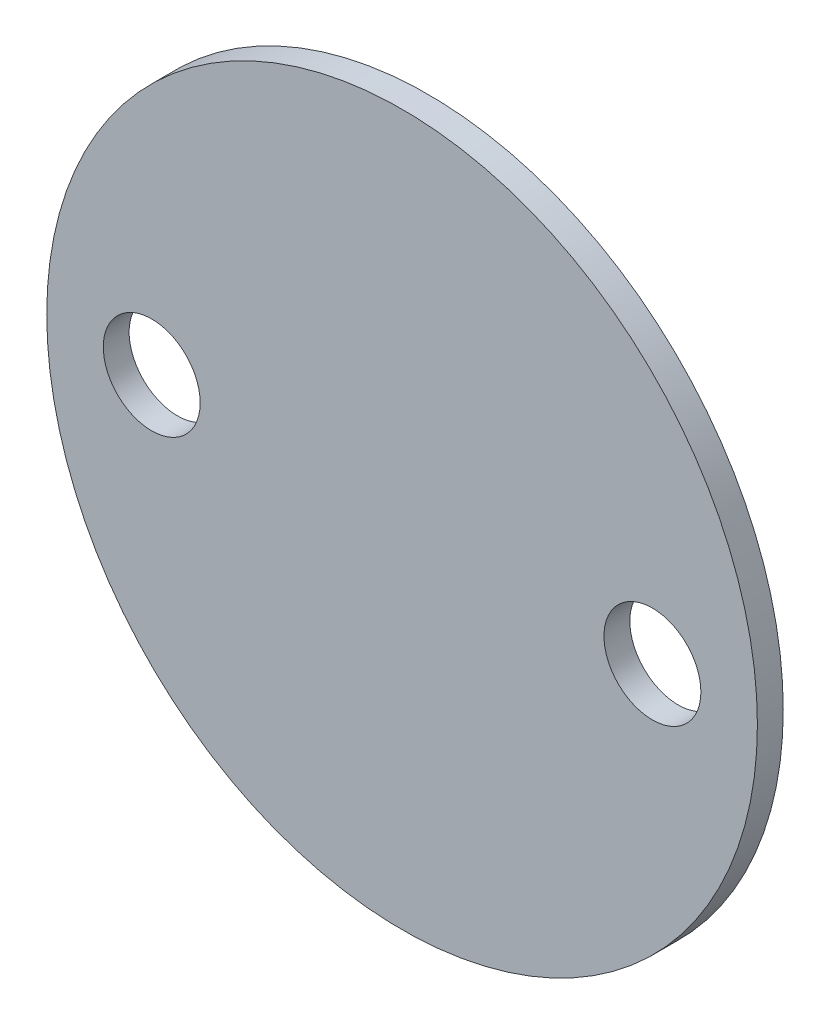
ISO-10303-21;
HEADER;
FILE_DESCRIPTION(('STEP AP214'),'2;1');
FILE_NAME('part.step','',(''),(''),'','','');
FILE_SCHEMA(('AUTOMOTIVE_DESIGN { 1 0 10303 214 1 1 1 1 }'));
ENDSEC;
DATA;
#1=APPLICATION_CONTEXT('core data for automotive mechanical design processes');
#2=APPLICATION_PROTOCOL_DEFINITION('international standard','automotive_design',2000,#1);
#3=PRODUCT_CONTEXT('',#1,'mechanical');
#4=PRODUCT('Part','Part','',(#3));
#5=PRODUCT_RELATED_PRODUCT_CATEGORY('part','',(#4));
#6=PRODUCT_DEFINITION_FORMATION('','',#4);
#7=PRODUCT_DEFINITION_CONTEXT('part definition',#1,'design');
#8=PRODUCT_DEFINITION('design','',#6,#7);
#9=PRODUCT_DEFINITION_SHAPE('','',#8);
#10=(LENGTH_UNIT() NAMED_UNIT(*) SI_UNIT(.MILLI.,.METRE.));
#11=(NAMED_UNIT(*) PLANE_ANGLE_UNIT() SI_UNIT($,.RADIAN.));
#12=(NAMED_UNIT(*) SI_UNIT($,.STERADIAN.) SOLID_ANGLE_UNIT());
#13=UNCERTAINTY_MEASURE_WITH_UNIT(LENGTH_MEASURE(1.E-05),#10,'distance_accuracy_value','');
#14=(GEOMETRIC_REPRESENTATION_CONTEXT(3) GLOBAL_UNCERTAINTY_ASSIGNED_CONTEXT((#13)) GLOBAL_UNIT_ASSIGNED_CONTEXT((#10,
#11,#12)) REPRESENTATION_CONTEXT('',''));
#15=CARTESIAN_POINT('',(0.,0.,0.));
#16=DIRECTION('',(0.,0.,1.));
#17=DIRECTION('',(1.,0.,0.));
#18=AXIS2_PLACEMENT_3D('',#15,#16,#17);
#19=CARTESIAN_POINT('',(-7.85352633355807,0.,0.8));
#20=DIRECTION('',(0.,0.,1.));
#21=DIRECTION('',(1.,0.,0.));
#22=AXIS2_PLACEMENT_3D('',#19,#20,#21);
#23=PLANE('',#22);
#24=CARTESIAN_POINT('',(-15.6035263335581,0.,0.8));
#25=DIRECTION('',(0.,0.,1.));
#26=DIRECTION('',(1.,0.,0.));
#27=AXIS2_PLACEMENT_3D('',#24,#25,#26);
#28=CIRCLE('',#27,1.5);
#29=CARTESIAN_POINT('',(-14.1035263335581,0.,0.8));
#30=VERTEX_POINT('',#29);
#31=EDGE_CURVE('E42',#30,#30,#28,.T.);
#32=ORIENTED_EDGE('',*,*,#31,.F.);
#33=EDGE_LOOP('',(#32));
#34=FACE_BOUND('',#33,.T.);
#35=CARTESIAN_POINT('',(-7.85352633355807,0.,0.8));
#36=DIRECTION('',(0.,0.,1.));
#37=DIRECTION('',(1.,0.,0.));
#38=AXIS2_PLACEMENT_3D('',#35,#36,#37);
#39=CIRCLE('',#38,11.);
#40=CARTESIAN_POINT('',(3.14647366644193,0.,0.8));
#41=VERTEX_POINT('',#40);
#42=EDGE_CURVE('E10',#41,#41,#39,.T.);
#43=ORIENTED_EDGE('',*,*,#42,.T.);
#44=EDGE_LOOP('',(#43));
#45=FACE_BOUND('',#44,.T.);
#46=CARTESIAN_POINT('',(-0.10352633355807,0.,0.8));
#47=DIRECTION('',(0.,0.,1.));
#48=DIRECTION('',(1.,0.,0.));
#49=AXIS2_PLACEMENT_3D('',#46,#47,#48);
#50=CIRCLE('',#49,1.5);
#51=CARTESIAN_POINT('',(1.39647366644193,0.,0.8));
#52=VERTEX_POINT('',#51);
#53=EDGE_CURVE('E47',#52,#52,#50,.T.);
#54=ORIENTED_EDGE('',*,*,#53,.F.);
#55=EDGE_LOOP('',(#54));
#56=FACE_BOUND('',#55,.T.);
#57=ADVANCED_FACE('F31',(#34,#45,#56),#23,.T.);
#58=CARTESIAN_POINT('',(-7.85352633355807,0.,0.));
#59=DIRECTION('',(0.,0.,1.));
#60=DIRECTION('',(1.,0.,0.));
#61=AXIS2_PLACEMENT_3D('',#58,#59,#60);
#62=PLANE('',#61);
#63=CARTESIAN_POINT('',(-7.85352633355807,0.,0.));
#64=DIRECTION('',(0.,0.,1.));
#65=DIRECTION('',(1.,0.,0.));
#66=AXIS2_PLACEMENT_3D('',#63,#64,#65);
#67=CIRCLE('',#66,11.);
#68=CARTESIAN_POINT('',(3.14647366644193,0.,0.));
#69=VERTEX_POINT('',#68);
#70=EDGE_CURVE('E35',#69,#69,#67,.T.);
#71=ORIENTED_EDGE('',*,*,#70,.F.);
#72=EDGE_LOOP('',(#71));
#73=FACE_BOUND('',#72,.T.);
#74=CARTESIAN_POINT('',(-15.6035263335581,0.,0.));
#75=DIRECTION('',(0.,0.,1.));
#76=DIRECTION('',(1.,0.,0.));
#77=AXIS2_PLACEMENT_3D('',#74,#75,#76);
#78=CIRCLE('',#77,1.5);
#79=CARTESIAN_POINT('',(-14.1035263335581,0.,0.));
#80=VERTEX_POINT('',#79);
#81=EDGE_CURVE('E44',#80,#80,#78,.T.);
#82=ORIENTED_EDGE('',*,*,#81,.T.);
#83=EDGE_LOOP('',(#82));
#84=FACE_BOUND('',#83,.T.);
#85=CARTESIAN_POINT('',(-0.10352633355807,0.,0.));
#86=DIRECTION('',(0.,0.,1.));
#87=DIRECTION('',(1.,0.,0.));
#88=AXIS2_PLACEMENT_3D('',#85,#86,#87);
#89=CIRCLE('',#88,1.5);
#90=CARTESIAN_POINT('',(1.39647366644193,0.,0.));
#91=VERTEX_POINT('',#90);
#92=EDGE_CURVE('E50',#91,#91,#89,.T.);
#93=ORIENTED_EDGE('',*,*,#92,.T.);
#94=EDGE_LOOP('',(#93));
#95=FACE_BOUND('',#94,.T.);
#96=ADVANCED_FACE('F60',(#73,#84,#95),#62,.F.);
#97=CARTESIAN_POINT('',(-7.85352633355807,0.,0.8));
#98=DIRECTION('',(0.,0.,-1.));
#99=DIRECTION('',(-1.,0.,0.));
#100=AXIS2_PLACEMENT_3D('',#97,#98,#99);
#101=CYLINDRICAL_SURFACE('',#100,11.);
#102=ORIENTED_EDGE('',*,*,#42,.F.);
#103=EDGE_LOOP('',(#102));
#104=FACE_BOUND('',#103,.T.);
#105=ORIENTED_EDGE('',*,*,#70,.T.);
#106=EDGE_LOOP('',(#105));
#107=FACE_BOUND('',#106,.T.);
#108=ADVANCED_FACE('F33',(#104,#107),#101,.T.);
#109=CARTESIAN_POINT('',(-15.6035263335581,0.,0.8));
#110=DIRECTION('',(0.,0.,-1.));
#111=DIRECTION('',(-1.,0.,0.));
#112=AXIS2_PLACEMENT_3D('',#109,#110,#111);
#113=CYLINDRICAL_SURFACE('',#112,1.5);
#114=ORIENTED_EDGE('',*,*,#31,.T.);
#115=EDGE_LOOP('',(#114));
#116=FACE_BOUND('',#115,.T.);
#117=ORIENTED_EDGE('',*,*,#81,.F.);
#118=EDGE_LOOP('',(#117));
#119=FACE_BOUND('',#118,.T.);
#120=ADVANCED_FACE('F69',(#116,#119),#113,.F.);
#121=CARTESIAN_POINT('',(-0.10352633355807,0.,0.8));
#122=DIRECTION('',(0.,0.,-1.));
#123=DIRECTION('',(-1.,0.,0.));
#124=AXIS2_PLACEMENT_3D('',#121,#122,#123);
#125=CYLINDRICAL_SURFACE('',#124,1.5);
#126=ORIENTED_EDGE('',*,*,#53,.T.);
#127=EDGE_LOOP('',(#126));
#128=FACE_BOUND('',#127,.T.);
#129=ORIENTED_EDGE('',*,*,#92,.F.);
#130=EDGE_LOOP('',(#129));
#131=FACE_BOUND('',#130,.T.);
#132=ADVANCED_FACE('F56',(#128,#131),#125,.F.);
#133=CLOSED_SHELL('',(#57,#96,#108,#120,#132));
#134=MANIFOLD_SOLID_BREP('B2',#133);
#135=ADVANCED_BREP_SHAPE_REPRESENTATION('',(#18,#134),#14);
#136=SHAPE_DEFINITION_REPRESENTATION(#9,#135);
ENDSEC;
END-ISO-10303-21;
